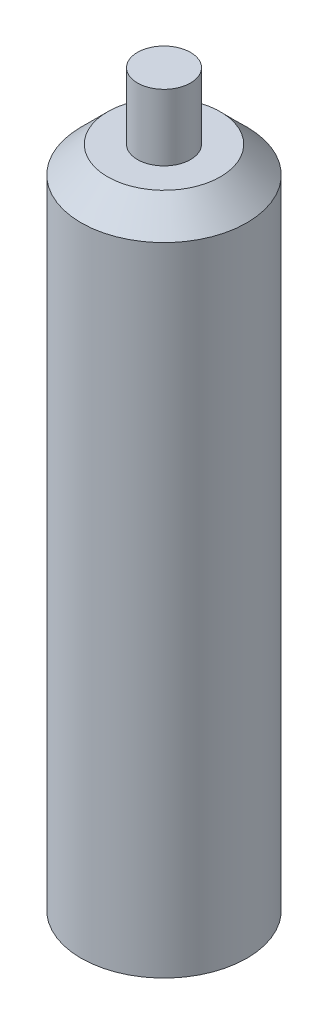
ISO-10303-21;
HEADER;
FILE_DESCRIPTION(('STEP AP214'),'2;1');
FILE_NAME('part.step','',(''),(''),'','','');
FILE_SCHEMA(('AUTOMOTIVE_DESIGN { 1 0 10303 214 1 1 1 1 }'));
ENDSEC;
DATA;
#1=APPLICATION_CONTEXT('core data for automotive mechanical design processes');
#2=APPLICATION_PROTOCOL_DEFINITION('international standard','automotive_design',2000,#1);
#3=PRODUCT_CONTEXT('',#1,'mechanical');
#4=PRODUCT('Part','Part','',(#3));
#5=PRODUCT_RELATED_PRODUCT_CATEGORY('part','',(#4));
#6=PRODUCT_DEFINITION_FORMATION('','',#4);
#7=PRODUCT_DEFINITION_CONTEXT('part definition',#1,'design');
#8=PRODUCT_DEFINITION('design','',#6,#7);
#9=PRODUCT_DEFINITION_SHAPE('','',#8);
#10=(LENGTH_UNIT() NAMED_UNIT(*) SI_UNIT(.MILLI.,.METRE.));
#11=(NAMED_UNIT(*) PLANE_ANGLE_UNIT() SI_UNIT($,.RADIAN.));
#12=(NAMED_UNIT(*) SI_UNIT($,.STERADIAN.) SOLID_ANGLE_UNIT());
#13=UNCERTAINTY_MEASURE_WITH_UNIT(LENGTH_MEASURE(1.E-05),#10,'distance_accuracy_value','');
#14=(GEOMETRIC_REPRESENTATION_CONTEXT(3) GLOBAL_UNCERTAINTY_ASSIGNED_CONTEXT((#13)) GLOBAL_UNIT_ASSIGNED_CONTEXT((#10,
#11,#12)) REPRESENTATION_CONTEXT('',''));
#15=CARTESIAN_POINT('',(0.,0.,0.));
#16=DIRECTION('',(0.,0.,1.));
#17=DIRECTION('',(1.,0.,0.));
#18=AXIS2_PLACEMENT_3D('',#15,#16,#17);
#19=CARTESIAN_POINT('',(0.,50.,0.));
#20=DIRECTION('',(0.,-1.,0.));
#21=DIRECTION('',(0.,0.,-1.));
#22=AXIS2_PLACEMENT_3D('',#19,#20,#21);
#23=CYLINDRICAL_SURFACE('',#22,6.25);
#24=CARTESIAN_POINT('',(0.,48.,0.));
#25=DIRECTION('',(0.,1.,0.));
#26=DIRECTION('',(0.,0.,1.));
#27=AXIS2_PLACEMENT_3D('',#24,#25,#26);
#28=CIRCLE('',#27,6.25);
#29=CARTESIAN_POINT('',(0.,48.,6.25));
#30=VERTEX_POINT('',#29);
#31=EDGE_CURVE('E10',#30,#30,#28,.F.);
#32=ORIENTED_EDGE('',*,*,#31,.T.);
#33=EDGE_LOOP('',(#32));
#34=FACE_BOUND('',#33,.T.);
#35=CARTESIAN_POINT('',(0.,0.,0.));
#36=DIRECTION('',(0.,1.,0.));
#37=DIRECTION('',(0.,0.,1.));
#38=AXIS2_PLACEMENT_3D('',#35,#36,#37);
#39=CIRCLE('',#38,6.25);
#40=CARTESIAN_POINT('',(0.,0.,6.25));
#41=VERTEX_POINT('',#40);
#42=EDGE_CURVE('E45',#41,#41,#39,.T.);
#43=ORIENTED_EDGE('',*,*,#42,.T.);
#44=EDGE_LOOP('',(#43));
#45=FACE_BOUND('',#44,.T.);
#46=ADVANCED_FACE('F30',(#34,#45),#23,.T.);
#47=CARTESIAN_POINT('',(0.,50.,0.));
#48=DIRECTION('',(0.,1.,0.));
#49=DIRECTION('',(0.,0.,1.));
#50=AXIS2_PLACEMENT_3D('',#47,#48,#49);
#51=PLANE('',#50);
#52=CARTESIAN_POINT('',(0.,50.,0.));
#53=DIRECTION('',(0.,1.,0.));
#54=DIRECTION('',(0.,0.,1.));
#55=AXIS2_PLACEMENT_3D('',#52,#53,#54);
#56=CIRCLE('',#55,4.25);
#57=CARTESIAN_POINT('',(0.,50.,4.25));
#58=VERTEX_POINT('',#57);
#59=EDGE_CURVE('E37',#58,#58,#56,.T.);
#60=ORIENTED_EDGE('',*,*,#59,.T.);
#61=EDGE_LOOP('',(#60));
#62=FACE_BOUND('',#61,.T.);
#63=CARTESIAN_POINT('',(0.,50.,0.));
#64=DIRECTION('',(0.,1.,0.));
#65=DIRECTION('',(0.,0.,1.));
#66=AXIS2_PLACEMENT_3D('',#63,#64,#65);
#67=CIRCLE('',#66,2.);
#68=CARTESIAN_POINT('',(0.,50.,2.));
#69=VERTEX_POINT('',#68);
#70=EDGE_CURVE('E41',#69,#69,#67,.T.);
#71=ORIENTED_EDGE('',*,*,#70,.F.);
#72=EDGE_LOOP('',(#71));
#73=FACE_BOUND('',#72,.T.);
#74=ADVANCED_FACE('F63',(#62,#73),#51,.T.);
#75=CARTESIAN_POINT('',(0.,0.,0.));
#76=DIRECTION('',(0.,1.,0.));
#77=DIRECTION('',(0.,0.,1.));
#78=AXIS2_PLACEMENT_3D('',#75,#76,#77);
#79=PLANE('',#78);
#80=ORIENTED_EDGE('',*,*,#42,.F.);
#81=EDGE_LOOP('',(#80));
#82=FACE_BOUND('',#81,.T.);
#83=ADVANCED_FACE('F59',(#82),#79,.F.);
#84=CARTESIAN_POINT('',(0.,55.,0.));
#85=DIRECTION('',(0.,-1.,0.));
#86=DIRECTION('',(0.,0.,-1.));
#87=AXIS2_PLACEMENT_3D('',#84,#85,#86);
#88=CYLINDRICAL_SURFACE('',#87,2.);
#89=CARTESIAN_POINT('',(0.,55.,0.));
#90=DIRECTION('',(0.,1.,0.));
#91=DIRECTION('',(0.,0.,1.));
#92=AXIS2_PLACEMENT_3D('',#89,#90,#91);
#93=CIRCLE('',#92,2.);
#94=CARTESIAN_POINT('',(0.,55.,2.));
#95=VERTEX_POINT('',#94);
#96=EDGE_CURVE('E49',#95,#95,#93,.T.);
#97=ORIENTED_EDGE('',*,*,#96,.F.);
#98=EDGE_LOOP('',(#97));
#99=FACE_BOUND('',#98,.T.);
#100=ORIENTED_EDGE('',*,*,#70,.T.);
#101=EDGE_LOOP('',(#100));
#102=FACE_BOUND('',#101,.T.);
#103=ADVANCED_FACE('F56',(#99,#102),#88,.T.);
#104=CARTESIAN_POINT('',(0.,55.,0.));
#105=DIRECTION('',(0.,1.,0.));
#106=DIRECTION('',(0.,0.,1.));
#107=AXIS2_PLACEMENT_3D('',#104,#105,#106);
#108=PLANE('',#107);
#109=ORIENTED_EDGE('',*,*,#96,.T.);
#110=EDGE_LOOP('',(#109));
#111=FACE_BOUND('',#110,.T.);
#112=ADVANCED_FACE('F54',(#111),#108,.T.);
#113=CARTESIAN_POINT('',(0.,50.,0.));
#114=DIRECTION('',(0.,-1.,0.));
#115=DIRECTION('',(0.,0.,-1.));
#116=AXIS2_PLACEMENT_3D('',#113,#114,#115);
#117=CONICAL_SURFACE('',#116,4.25,0.785398163397447);
#118=ORIENTED_EDGE('',*,*,#31,.F.);
#119=EDGE_LOOP('',(#118));
#120=FACE_BOUND('',#119,.T.);
#121=ORIENTED_EDGE('',*,*,#59,.F.);
#122=EDGE_LOOP('',(#121));
#123=FACE_BOUND('',#122,.T.);
#124=ADVANCED_FACE('F32',(#120,#123),#117,.T.);
#125=CLOSED_SHELL('',(#46,#74,#83,#103,#112,#124));
#126=MANIFOLD_SOLID_BREP('B2',#125);
#127=ADVANCED_BREP_SHAPE_REPRESENTATION('',(#18,#126),#14);
#128=SHAPE_DEFINITION_REPRESENTATION(#9,#127);
ENDSEC;
END-ISO-10303-21;
